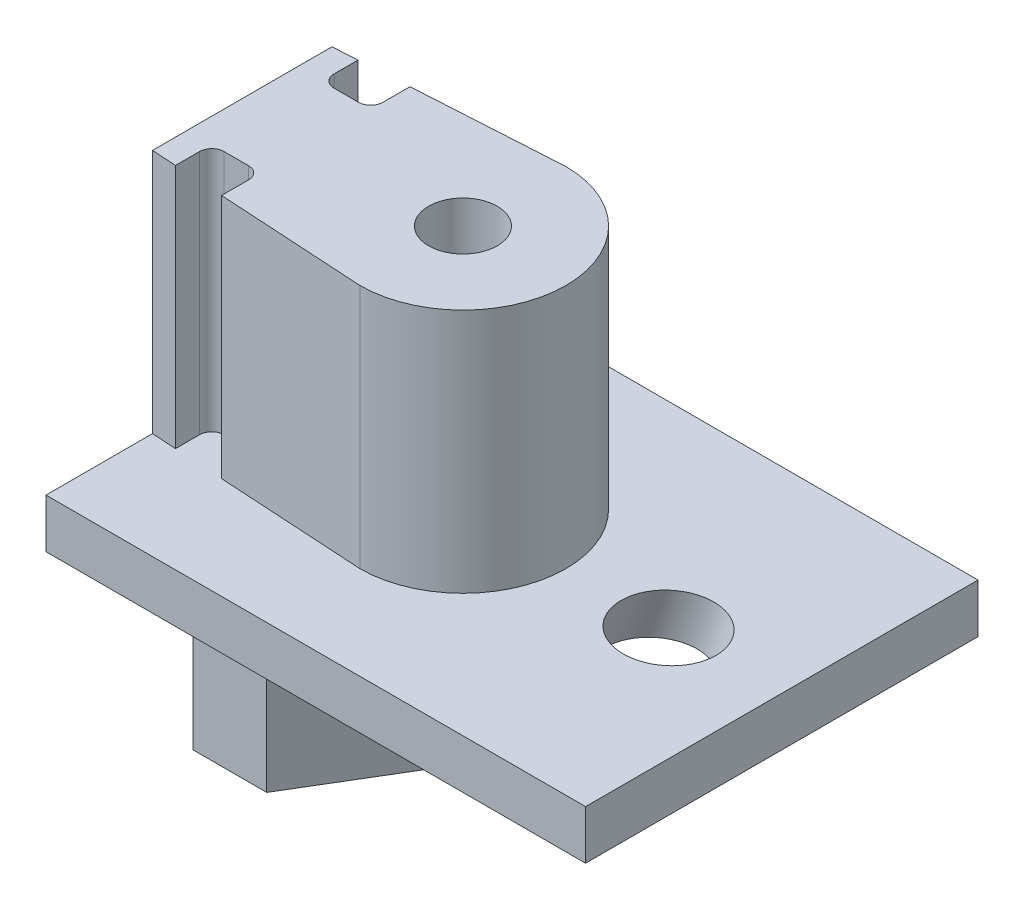
ISO-10303-21;
HEADER;
FILE_DESCRIPTION(('STEP AP214'),'2;1');
FILE_NAME('part.step','',(''),(''),'','','');
FILE_SCHEMA(('AUTOMOTIVE_DESIGN { 1 0 10303 214 1 1 1 1 }'));
ENDSEC;
DATA;
#1=APPLICATION_CONTEXT('core data for automotive mechanical design processes');
#2=APPLICATION_PROTOCOL_DEFINITION('international standard','automotive_design',2000,#1);
#3=PRODUCT_CONTEXT('',#1,'mechanical');
#4=PRODUCT('Part','Part','',(#3));
#5=PRODUCT_RELATED_PRODUCT_CATEGORY('part','',(#4));
#6=PRODUCT_DEFINITION_FORMATION('','',#4);
#7=PRODUCT_DEFINITION_CONTEXT('part definition',#1,'design');
#8=PRODUCT_DEFINITION('design','',#6,#7);
#9=PRODUCT_DEFINITION_SHAPE('','',#8);
#10=(LENGTH_UNIT() NAMED_UNIT(*) SI_UNIT(.MILLI.,.METRE.));
#11=(NAMED_UNIT(*) PLANE_ANGLE_UNIT() SI_UNIT($,.RADIAN.));
#12=(NAMED_UNIT(*) SI_UNIT($,.STERADIAN.) SOLID_ANGLE_UNIT());
#13=UNCERTAINTY_MEASURE_WITH_UNIT(LENGTH_MEASURE(1.E-05),#10,'distance_accuracy_value','');
#14=(GEOMETRIC_REPRESENTATION_CONTEXT(3) GLOBAL_UNCERTAINTY_ASSIGNED_CONTEXT((#13)) GLOBAL_UNIT_ASSIGNED_CONTEXT((#10,
#11,#12)) REPRESENTATION_CONTEXT('',''));
#15=CARTESIAN_POINT('',(0.,0.,0.));
#16=DIRECTION('',(0.,0.,1.));
#17=DIRECTION('',(1.,0.,0.));
#18=AXIS2_PLACEMENT_3D('',#15,#16,#17);
#19=CARTESIAN_POINT('',(-2.50000000000002,2.5,0.9));
#20=DIRECTION('',(0.0598922907279451,0.,-0.998204845465779));
#21=DIRECTION('',(-0.998204845465779,0.,-0.0598922907279451));
#22=AXIS2_PLACEMENT_3D('',#19,#20,#21);
#23=PLANE('',#22);
#24=DIRECTION('',(0.998204845465779,0.,0.0598922907279451));
#25=VECTOR('',#24,1.);
#26=CARTESIAN_POINT('',(-2.50000000000002,2.5,0.9));
#27=LINE('',#26,#25);
#28=CARTESIAN_POINT('',(-2.25,2.5,0.915000000000001));
#29=VERTEX_POINT('',#28);
#30=CARTESIAN_POINT('',(-2.,2.5,0.93));
#31=VERTEX_POINT('',#30);
#32=EDGE_CURVE('E295',#29,#31,#27,.T.);
#33=ORIENTED_EDGE('',*,*,#32,.F.);
#34=DIRECTION('',(0.,-1.,0.));
#35=VECTOR('',#34,1.);
#36=CARTESIAN_POINT('',(-2.25,2.5,0.915000000000001));
#37=LINE('',#36,#35);
#38=CARTESIAN_POINT('',(-2.25,0.,0.915000000000001));
#39=VERTEX_POINT('',#38);
#40=EDGE_CURVE('E236',#29,#39,#37,.T.);
#41=ORIENTED_EDGE('',*,*,#40,.T.);
#42=DIRECTION('',(0.998204845465779,0.,0.0598922907279451));
#43=VECTOR('',#42,1.);
#44=CARTESIAN_POINT('',(-2.50000000000002,0.,0.9));
#45=LINE('',#44,#43);
#46=CARTESIAN_POINT('',(-2.,0.,0.93));
#47=VERTEX_POINT('',#46);
#48=EDGE_CURVE('E292',#39,#47,#45,.T.);
#49=ORIENTED_EDGE('',*,*,#48,.T.);
#50=DIRECTION('',(0.,-1.,0.));
#51=VECTOR('',#50,1.);
#52=CARTESIAN_POINT('',(-2.,2.5,0.93));
#53=LINE('',#52,#51);
#54=EDGE_CURVE('E365',#31,#47,#53,.T.);
#55=ORIENTED_EDGE('',*,*,#54,.F.);
#56=EDGE_LOOP('',(#33,#41,#49,#55));
#57=FACE_BOUND('',#56,.T.);
#58=ADVANCED_FACE('F37',(#57),#23,.F.);
#59=CARTESIAN_POINT('',(-2.,2.5,0.93));
#60=DIRECTION('',(-1.,0.,0.));
#61=DIRECTION('',(0.,0.,1.));
#62=AXIS2_PLACEMENT_3D('',#59,#60,#61);
#63=PLANE('',#62);
#64=DIRECTION('',(0.,0.,-1.));
#65=VECTOR('',#64,1.);
#66=CARTESIAN_POINT('',(-2.,0.,0.93));
#67=LINE('',#66,#65);
#68=CARTESIAN_POINT('',(-2.,0.,0.685));
#69=VERTEX_POINT('',#68);
#70=EDGE_CURVE('E329',#47,#69,#67,.T.);
#71=ORIENTED_EDGE('',*,*,#70,.T.);
#72=DIRECTION('',(0.,-1.,0.));
#73=VECTOR('',#72,1.);
#74=CARTESIAN_POINT('',(-2.,2.5,0.685));
#75=LINE('',#74,#73);
#76=CARTESIAN_POINT('',(-2.,2.5,0.685));
#77=VERTEX_POINT('',#76);
#78=EDGE_CURVE('E373',#69,#77,#75,.F.);
#79=ORIENTED_EDGE('',*,*,#78,.T.);
#80=DIRECTION('',(0.,0.,-1.));
#81=VECTOR('',#80,1.);
#82=CARTESIAN_POINT('',(-2.,2.5,0.93));
#83=LINE('',#82,#81);
#84=EDGE_CURVE('E297',#31,#77,#83,.T.);
#85=ORIENTED_EDGE('',*,*,#84,.F.);
#86=ORIENTED_EDGE('',*,*,#54,.T.);
#87=EDGE_LOOP('',(#71,#79,#85,#86));
#88=FACE_BOUND('',#87,.T.);
#89=ADVANCED_FACE('F464',(#88),#63,.F.);
#90=CARTESIAN_POINT('',(-1.5,2.5,0.56));
#91=DIRECTION('',(0.,0.,1.));
#92=DIRECTION('',(1.,0.,0.));
#93=AXIS2_PLACEMENT_3D('',#90,#91,#92);
#94=PLANE('',#93);
#95=DIRECTION('',(-1.,0.,0.));
#96=VECTOR('',#95,1.);
#97=CARTESIAN_POINT('',(-1.5,2.5,0.56));
#98=LINE('',#97,#96);
#99=CARTESIAN_POINT('',(-1.625,2.5,0.56));
#100=VERTEX_POINT('',#99);
#101=CARTESIAN_POINT('',(-1.875,2.5,0.56));
#102=VERTEX_POINT('',#101);
#103=EDGE_CURVE('E301',#100,#102,#98,.T.);
#104=ORIENTED_EDGE('',*,*,#103,.T.);
#105=DIRECTION('',(0.,-1.,0.));
#106=VECTOR('',#105,1.);
#107=CARTESIAN_POINT('',(-1.875,2.5,0.56));
#108=LINE('',#107,#106);
#109=CARTESIAN_POINT('',(-1.875,0.,0.56));
#110=VERTEX_POINT('',#109);
#111=EDGE_CURVE('E370',#102,#110,#108,.T.);
#112=ORIENTED_EDGE('',*,*,#111,.T.);
#113=DIRECTION('',(-1.,0.,0.));
#114=VECTOR('',#113,1.);
#115=CARTESIAN_POINT('',(-1.5,0.,0.56));
#116=LINE('',#115,#114);
#117=CARTESIAN_POINT('',(-1.625,0.,0.56));
#118=VERTEX_POINT('',#117);
#119=EDGE_CURVE('E332',#118,#110,#116,.T.);
#120=ORIENTED_EDGE('',*,*,#119,.F.);
#121=DIRECTION('',(0.,-1.,0.));
#122=VECTOR('',#121,1.);
#123=CARTESIAN_POINT('',(-1.625,2.5,0.56));
#124=LINE('',#123,#122);
#125=EDGE_CURVE('E368',#118,#100,#124,.F.);
#126=ORIENTED_EDGE('',*,*,#125,.T.);
#127=EDGE_LOOP('',(#104,#112,#120,#126));
#128=FACE_BOUND('',#127,.T.);
#129=ADVANCED_FACE('F454',(#128),#94,.T.);
#130=CARTESIAN_POINT('',(-1.5,2.5,0.56));
#131=DIRECTION('',(1.,0.,0.));
#132=DIRECTION('',(0.,0.,-1.));
#133=AXIS2_PLACEMENT_3D('',#130,#131,#132);
#134=PLANE('',#133);
#135=DIRECTION('',(0.,0.,1.));
#136=VECTOR('',#135,1.);
#137=CARTESIAN_POINT('',(-1.5,2.5,0.56));
#138=LINE('',#137,#136);
#139=CARTESIAN_POINT('',(-1.5,2.5,0.685));
#140=VERTEX_POINT('',#139);
#141=CARTESIAN_POINT('',(-1.5,2.5,0.96));
#142=VERTEX_POINT('',#141);
#143=EDGE_CURVE('E304',#140,#142,#138,.T.);
#144=ORIENTED_EDGE('',*,*,#143,.F.);
#145=DIRECTION('',(0.,-1.,0.));
#146=VECTOR('',#145,1.);
#147=CARTESIAN_POINT('',(-1.5,2.5,0.685));
#148=LINE('',#147,#146);
#149=CARTESIAN_POINT('',(-1.5,0.,0.685));
#150=VERTEX_POINT('',#149);
#151=EDGE_CURVE('E375',#140,#150,#148,.T.);
#152=ORIENTED_EDGE('',*,*,#151,.T.);
#153=DIRECTION('',(0.,0.,1.));
#154=VECTOR('',#153,1.);
#155=CARTESIAN_POINT('',(-1.5,0.,0.56));
#156=LINE('',#155,#154);
#157=CARTESIAN_POINT('',(-1.5,0.,0.96));
#158=VERTEX_POINT('',#157);
#159=EDGE_CURVE('E334',#150,#158,#156,.T.);
#160=ORIENTED_EDGE('',*,*,#159,.T.);
#161=DIRECTION('',(0.,-1.,0.));
#162=VECTOR('',#161,1.);
#163=CARTESIAN_POINT('',(-1.5,2.5,0.96));
#164=LINE('',#163,#162);
#165=EDGE_CURVE('E362',#142,#158,#164,.T.);
#166=ORIENTED_EDGE('',*,*,#165,.F.);
#167=EDGE_LOOP('',(#144,#152,#160,#166));
#168=FACE_BOUND('',#167,.T.);
#169=ADVANCED_FACE('F444',(#168),#134,.F.);
#170=CARTESIAN_POINT('',(0.,2.5,1.05));
#171=DIRECTION('',(-0.0598922907279466,0.,0.998204845465779));
#172=DIRECTION('',(0.998204845465779,0.,0.0598922907279466));
#173=AXIS2_PLACEMENT_3D('',#170,#171,#172);
#174=PLANE('',#173);
#175=DIRECTION('',(-0.998204845465779,0.,-0.0598922907279466));
#176=VECTOR('',#175,1.);
#177=CARTESIAN_POINT('',(0.,0.,1.05));
#178=LINE('',#177,#176);
#179=CARTESIAN_POINT('',(0.,0.,1.05));
#180=VERTEX_POINT('',#179);
#181=EDGE_CURVE('E337',#180,#158,#178,.T.);
#182=ORIENTED_EDGE('',*,*,#181,.F.);
#183=DIRECTION('',(0.,-1.,0.));
#184=VECTOR('',#183,1.);
#185=CARTESIAN_POINT('',(0.,2.5,1.05));
#186=LINE('',#185,#184);
#187=CARTESIAN_POINT('',(0.,2.5,1.05));
#188=VERTEX_POINT('',#187);
#189=EDGE_CURVE('E359',#188,#180,#186,.T.);
#190=ORIENTED_EDGE('',*,*,#189,.F.);
#191=DIRECTION('',(-0.998204845465779,0.,-0.0598922907279466));
#192=VECTOR('',#191,1.);
#193=CARTESIAN_POINT('',(0.,2.5,1.05));
#194=LINE('',#193,#192);
#195=EDGE_CURVE('E306',#188,#142,#194,.T.);
#196=ORIENTED_EDGE('',*,*,#195,.T.);
#197=ORIENTED_EDGE('',*,*,#165,.T.);
#198=EDGE_LOOP('',(#182,#190,#196,#197));
#199=FACE_BOUND('',#198,.T.);
#200=ADVANCED_FACE('F440',(#199),#174,.T.);
#201=CARTESIAN_POINT('',(0.,2.5,0.));
#202=DIRECTION('',(0.,-1.,0.));
#203=DIRECTION('',(0.,0.,-1.));
#204=AXIS2_PLACEMENT_3D('',#201,#202,#203);
#205=CYLINDRICAL_SURFACE('',#204,1.05);
#206=CARTESIAN_POINT('',(0.,0.,0.));
#207=DIRECTION('',(0.,-1.,0.));
#208=DIRECTION('',(0.,0.,-1.));
#209=AXIS2_PLACEMENT_3D('',#206,#207,#208);
#210=CIRCLE('',#209,1.05);
#211=CARTESIAN_POINT('',(0.,0.,-1.05));
#212=VERTEX_POINT('',#211);
#213=EDGE_CURVE('E339',#212,#180,#210,.T.);
#214=ORIENTED_EDGE('',*,*,#213,.F.);
#215=DIRECTION('',(0.,-1.,0.));
#216=VECTOR('',#215,1.);
#217=CARTESIAN_POINT('',(0.,2.5,-1.05));
#218=LINE('',#217,#216);
#219=CARTESIAN_POINT('',(0.,2.5,-1.05));
#220=VERTEX_POINT('',#219);
#221=EDGE_CURVE('E356',#220,#212,#218,.T.);
#222=ORIENTED_EDGE('',*,*,#221,.F.);
#223=CARTESIAN_POINT('',(0.,2.5,0.));
#224=DIRECTION('',(0.,-1.,0.));
#225=DIRECTION('',(0.,0.,-1.));
#226=AXIS2_PLACEMENT_3D('',#223,#224,#225);
#227=CIRCLE('',#226,1.05);
#228=EDGE_CURVE('E309',#220,#188,#227,.T.);
#229=ORIENTED_EDGE('',*,*,#228,.T.);
#230=ORIENTED_EDGE('',*,*,#189,.T.);
#231=EDGE_LOOP('',(#214,#222,#229,#230));
#232=FACE_BOUND('',#231,.T.);
#233=ADVANCED_FACE('F436',(#232),#205,.T.);
#234=CARTESIAN_POINT('',(-1.5,2.5,-0.96));
#235=DIRECTION('',(-0.0598922907279466,0.,-0.998204845465779));
#236=DIRECTION('',(-0.998204845465779,0.,0.0598922907279466));
#237=AXIS2_PLACEMENT_3D('',#234,#235,#236);
#238=PLANE('',#237);
#239=DIRECTION('',(0.998204845465779,0.,-0.0598922907279466));
#240=VECTOR('',#239,1.);
#241=CARTESIAN_POINT('',(-1.5,0.,-0.96));
#242=LINE('',#241,#240);
#243=CARTESIAN_POINT('',(-1.5,0.,-0.96));
#244=VERTEX_POINT('',#243);
#245=EDGE_CURVE('E341',#244,#212,#242,.T.);
#246=ORIENTED_EDGE('',*,*,#245,.F.);
#247=DIRECTION('',(0.,-1.,0.));
#248=VECTOR('',#247,1.);
#249=CARTESIAN_POINT('',(-1.5,2.5,-0.96));
#250=LINE('',#249,#248);
#251=CARTESIAN_POINT('',(-1.5,2.5,-0.96));
#252=VERTEX_POINT('',#251);
#253=EDGE_CURVE('E353',#252,#244,#250,.T.);
#254=ORIENTED_EDGE('',*,*,#253,.F.);
#255=DIRECTION('',(0.998204845465779,0.,-0.0598922907279466));
#256=VECTOR('',#255,1.);
#257=CARTESIAN_POINT('',(-1.5,2.5,-0.96));
#258=LINE('',#257,#256);
#259=EDGE_CURVE('E312',#252,#220,#258,.T.);
#260=ORIENTED_EDGE('',*,*,#259,.T.);
#261=ORIENTED_EDGE('',*,*,#221,.T.);
#262=EDGE_LOOP('',(#246,#254,#260,#261));
#263=FACE_BOUND('',#262,.T.);
#264=ADVANCED_FACE('F432',(#263),#238,.T.);
#265=CARTESIAN_POINT('',(-1.5,2.5,-0.96));
#266=DIRECTION('',(1.,0.,0.));
#267=DIRECTION('',(0.,0.,-1.));
#268=AXIS2_PLACEMENT_3D('',#265,#266,#267);
#269=PLANE('',#268);
#270=DIRECTION('',(0.,0.,1.));
#271=VECTOR('',#270,1.);
#272=CARTESIAN_POINT('',(-1.5,0.,-0.96));
#273=LINE('',#272,#271);
#274=CARTESIAN_POINT('',(-1.5,0.,-0.685));
#275=VERTEX_POINT('',#274);
#276=EDGE_CURVE('E343',#244,#275,#273,.T.);
#277=ORIENTED_EDGE('',*,*,#276,.T.);
#278=DIRECTION('',(0.,-1.,0.));
#279=VECTOR('',#278,1.);
#280=CARTESIAN_POINT('',(-1.5,2.5,-0.685));
#281=LINE('',#280,#279);
#282=CARTESIAN_POINT('',(-1.5,2.5,-0.685));
#283=VERTEX_POINT('',#282);
#284=EDGE_CURVE('E383',#275,#283,#281,.F.);
#285=ORIENTED_EDGE('',*,*,#284,.T.);
#286=DIRECTION('',(0.,0.,1.));
#287=VECTOR('',#286,1.);
#288=CARTESIAN_POINT('',(-1.5,2.5,-0.96));
#289=LINE('',#288,#287);
#290=EDGE_CURVE('E315',#252,#283,#289,.T.);
#291=ORIENTED_EDGE('',*,*,#290,.F.);
#292=ORIENTED_EDGE('',*,*,#253,.T.);
#293=EDGE_LOOP('',(#277,#285,#291,#292));
#294=FACE_BOUND('',#293,.T.);
#295=ADVANCED_FACE('F427',(#294),#269,.F.);
#296=CARTESIAN_POINT('',(-2.,2.5,-0.56));
#297=DIRECTION('',(0.,0.,-1.));
#298=DIRECTION('',(-1.,0.,0.));
#299=AXIS2_PLACEMENT_3D('',#296,#297,#298);
#300=PLANE('',#299);
#301=DIRECTION('',(1.,0.,0.));
#302=VECTOR('',#301,1.);
#303=CARTESIAN_POINT('',(-2.,2.5,-0.56));
#304=LINE('',#303,#302);
#305=CARTESIAN_POINT('',(-1.875,2.5,-0.56));
#306=VERTEX_POINT('',#305);
#307=CARTESIAN_POINT('',(-1.625,2.5,-0.56));
#308=VERTEX_POINT('',#307);
#309=EDGE_CURVE('E318',#306,#308,#304,.T.);
#310=ORIENTED_EDGE('',*,*,#309,.T.);
#311=DIRECTION('',(0.,-1.,0.));
#312=VECTOR('',#311,1.);
#313=CARTESIAN_POINT('',(-1.625,2.5,-0.56));
#314=LINE('',#313,#312);
#315=CARTESIAN_POINT('',(-1.625,0.,-0.56));
#316=VERTEX_POINT('',#315);
#317=EDGE_CURVE('E380',#308,#316,#314,.T.);
#318=ORIENTED_EDGE('',*,*,#317,.T.);
#319=DIRECTION('',(1.,0.,0.));
#320=VECTOR('',#319,1.);
#321=CARTESIAN_POINT('',(-2.,0.,-0.56));
#322=LINE('',#321,#320);
#323=CARTESIAN_POINT('',(-1.875,0.,-0.56));
#324=VERTEX_POINT('',#323);
#325=EDGE_CURVE('E346',#324,#316,#322,.T.);
#326=ORIENTED_EDGE('',*,*,#325,.F.);
#327=DIRECTION('',(0.,-1.,0.));
#328=VECTOR('',#327,1.);
#329=CARTESIAN_POINT('',(-1.875,2.5,-0.56));
#330=LINE('',#329,#328);
#331=EDGE_CURVE('E378',#324,#306,#330,.F.);
#332=ORIENTED_EDGE('',*,*,#331,.T.);
#333=EDGE_LOOP('',(#310,#318,#326,#332));
#334=FACE_BOUND('',#333,.T.);
#335=ADVANCED_FACE('F420',(#334),#300,.T.);
#336=CARTESIAN_POINT('',(-2.,2.5,-0.93));
#337=DIRECTION('',(1.,0.,0.));
#338=DIRECTION('',(0.,0.,-1.));
#339=AXIS2_PLACEMENT_3D('',#336,#337,#338);
#340=PLANE('',#339);
#341=DIRECTION('',(0.,0.,1.));
#342=VECTOR('',#341,1.);
#343=CARTESIAN_POINT('',(-2.,2.5,-0.93));
#344=LINE('',#343,#342);
#345=CARTESIAN_POINT('',(-2.,2.5,-0.93));
#346=VERTEX_POINT('',#345);
#347=CARTESIAN_POINT('',(-2.,2.5,-0.685));
#348=VERTEX_POINT('',#347);
#349=EDGE_CURVE('E321',#346,#348,#344,.T.);
#350=ORIENTED_EDGE('',*,*,#349,.T.);
#351=DIRECTION('',(0.,-1.,0.));
#352=VECTOR('',#351,1.);
#353=CARTESIAN_POINT('',(-2.,0.,-0.685));
#354=LINE('',#353,#352);
#355=CARTESIAN_POINT('',(-2.,0.,-0.685));
#356=VERTEX_POINT('',#355);
#357=EDGE_CURVE('E385',#348,#356,#354,.T.);
#358=ORIENTED_EDGE('',*,*,#357,.T.);
#359=DIRECTION('',(0.,0.,1.));
#360=VECTOR('',#359,1.);
#361=CARTESIAN_POINT('',(-2.,0.,-0.93));
#362=LINE('',#361,#360);
#363=CARTESIAN_POINT('',(-2.,0.,-0.93));
#364=VERTEX_POINT('',#363);
#365=EDGE_CURVE('E348',#364,#356,#362,.T.);
#366=ORIENTED_EDGE('',*,*,#365,.F.);
#367=DIRECTION('',(0.,-1.,0.));
#368=VECTOR('',#367,1.);
#369=CARTESIAN_POINT('',(-2.,2.5,-0.93));
#370=LINE('',#369,#368);
#371=EDGE_CURVE('E326',#346,#364,#370,.T.);
#372=ORIENTED_EDGE('',*,*,#371,.F.);
#373=EDGE_LOOP('',(#350,#358,#366,#372));
#374=FACE_BOUND('',#373,.T.);
#375=ADVANCED_FACE('F412',(#374),#340,.T.);
#376=CARTESIAN_POINT('',(-2.50000000000002,2.5,-0.9));
#377=DIRECTION('',(-0.0598922907279451,0.,-0.998204845465779));
#378=DIRECTION('',(-0.998204845465779,0.,0.0598922907279451));
#379=AXIS2_PLACEMENT_3D('',#376,#377,#378);
#380=PLANE('',#379);
#381=DIRECTION('',(0.,-1.,0.));
#382=VECTOR('',#381,1.);
#383=CARTESIAN_POINT('',(-2.25,2.5,-0.915000000000001));
#384=LINE('',#383,#382);
#385=CARTESIAN_POINT('',(-2.25,2.5,-0.915));
#386=VERTEX_POINT('',#385);
#387=CARTESIAN_POINT('',(-2.25,0.,-0.915));
#388=VERTEX_POINT('',#387);
#389=EDGE_CURVE('E243',#386,#388,#384,.T.);
#390=ORIENTED_EDGE('',*,*,#389,.F.);
#391=DIRECTION('',(0.998204845465779,0.,-0.0598922907279451));
#392=VECTOR('',#391,1.);
#393=CARTESIAN_POINT('',(-2.50000000000002,2.5,-0.9));
#394=LINE('',#393,#392);
#395=EDGE_CURVE('E324',#386,#346,#394,.T.);
#396=ORIENTED_EDGE('',*,*,#395,.T.);
#397=ORIENTED_EDGE('',*,*,#371,.T.);
#398=DIRECTION('',(0.998204845465779,0.,-0.0598922907279451));
#399=VECTOR('',#398,1.);
#400=CARTESIAN_POINT('',(-2.50000000000002,0.,-0.9));
#401=LINE('',#400,#399);
#402=EDGE_CURVE('E298',#388,#364,#401,.T.);
#403=ORIENTED_EDGE('',*,*,#402,.F.);
#404=EDGE_LOOP('',(#390,#396,#397,#403));
#405=FACE_BOUND('',#404,.T.);
#406=ADVANCED_FACE('F491',(#405),#380,.T.);
#407=CARTESIAN_POINT('',(0.,2.5,0.));
#408=DIRECTION('',(0.,-1.,0.));
#409=DIRECTION('',(0.,0.,-1.));
#410=AXIS2_PLACEMENT_3D('',#407,#408,#409);
#411=PLANE('',#410);
#412=CARTESIAN_POINT('',(0.,2.5,0.));
#413=DIRECTION('',(0.,1.,0.));
#414=DIRECTION('',(0.,0.,1.));
#415=AXIS2_PLACEMENT_3D('',#412,#413,#414);
#416=CIRCLE('',#415,0.35);
#417=CARTESIAN_POINT('',(0.,2.5,0.35));
#418=VERTEX_POINT('',#417);
#419=EDGE_CURVE('E282',#418,#418,#416,.T.);
#420=ORIENTED_EDGE('',*,*,#419,.F.);
#421=EDGE_LOOP('',(#420));
#422=FACE_BOUND('',#421,.T.);
#423=ORIENTED_EDGE('',*,*,#395,.F.);
#424=DIRECTION('',(0.,0.,1.));
#425=VECTOR('',#424,1.);
#426=CARTESIAN_POINT('',(-2.25,2.5,2.));
#427=LINE('',#426,#425);
#428=EDGE_CURVE('E233',#386,#29,#427,.T.);
#429=ORIENTED_EDGE('',*,*,#428,.T.);
#430=ORIENTED_EDGE('',*,*,#32,.T.);
#431=ORIENTED_EDGE('',*,*,#84,.T.);
#432=CARTESIAN_POINT('',(-1.875,2.5,0.685));
#433=DIRECTION('',(0.,-1.,0.));
#434=DIRECTION('',(0.,0.,-1.));
#435=AXIS2_PLACEMENT_3D('',#432,#433,#434);
#436=CIRCLE('',#435,0.125);
#437=EDGE_CURVE('E390',#77,#102,#436,.T.);
#438=ORIENTED_EDGE('',*,*,#437,.T.);
#439=ORIENTED_EDGE('',*,*,#103,.F.);
#440=CARTESIAN_POINT('',(-1.625,2.5,0.685));
#441=DIRECTION('',(0.,-1.,0.));
#442=DIRECTION('',(0.,0.,-1.));
#443=AXIS2_PLACEMENT_3D('',#440,#441,#442);
#444=CIRCLE('',#443,0.125);
#445=EDGE_CURVE('E394',#100,#140,#444,.T.);
#446=ORIENTED_EDGE('',*,*,#445,.T.);
#447=ORIENTED_EDGE('',*,*,#143,.T.);
#448=ORIENTED_EDGE('',*,*,#195,.F.);
#449=ORIENTED_EDGE('',*,*,#228,.F.);
#450=ORIENTED_EDGE('',*,*,#259,.F.);
#451=ORIENTED_EDGE('',*,*,#290,.T.);
#452=CARTESIAN_POINT('',(-1.625,2.5,-0.685));
#453=DIRECTION('',(0.,-1.,0.));
#454=DIRECTION('',(0.,0.,-1.));
#455=AXIS2_PLACEMENT_3D('',#452,#453,#454);
#456=CIRCLE('',#455,0.125);
#457=EDGE_CURVE('E398',#283,#308,#456,.T.);
#458=ORIENTED_EDGE('',*,*,#457,.T.);
#459=ORIENTED_EDGE('',*,*,#309,.F.);
#460=CARTESIAN_POINT('',(-1.875,2.5,-0.685));
#461=DIRECTION('',(0.,-1.,0.));
#462=DIRECTION('',(0.,0.,-1.));
#463=AXIS2_PLACEMENT_3D('',#460,#461,#462);
#464=CIRCLE('',#463,0.125);
#465=EDGE_CURVE('E46',#306,#348,#464,.T.);
#466=ORIENTED_EDGE('',*,*,#465,.T.);
#467=ORIENTED_EDGE('',*,*,#349,.F.);
#468=EDGE_LOOP('',(#423,#429,#430,#431,#438,#439,#446,#447,#448,#449,#450,#451,#458,#459,#466,#467));
#469=FACE_BOUND('',#468,.T.);
#470=ADVANCED_FACE('F406',(#422,#469),#411,.F.);
#471=CARTESIAN_POINT('',(0.,0.,0.));
#472=DIRECTION('',(0.,1.,0.));
#473=DIRECTION('',(0.,0.,1.));
#474=AXIS2_PLACEMENT_3D('',#471,#472,#473);
#475=CYLINDRICAL_SURFACE('',#474,0.35);
#476=CARTESIAN_POINT('',(0.,0.,0.));
#477=DIRECTION('',(0.,1.,0.));
#478=DIRECTION('',(0.,0.,1.));
#479=AXIS2_PLACEMENT_3D('',#476,#477,#478);
#480=CIRCLE('',#479,0.35);
#481=CARTESIAN_POINT('',(0.,0.,0.35));
#482=VERTEX_POINT('',#481);
#483=EDGE_CURVE('E289',#482,#482,#480,.T.);
#484=ORIENTED_EDGE('',*,*,#483,.F.);
#485=EDGE_LOOP('',(#484));
#486=FACE_BOUND('',#485,.T.);
#487=ORIENTED_EDGE('',*,*,#419,.T.);
#488=EDGE_LOOP('',(#487));
#489=FACE_BOUND('',#488,.T.);
#490=ADVANCED_FACE('F498',(#486,#489),#475,.F.);
#491=CARTESIAN_POINT('',(-1.875,2.5,0.685));
#492=DIRECTION('',(0.,-1.,0.));
#493=DIRECTION('',(0.,0.,-1.));
#494=AXIS2_PLACEMENT_3D('',#491,#492,#493);
#495=CYLINDRICAL_SURFACE('',#494,0.125);
#496=ORIENTED_EDGE('',*,*,#437,.F.);
#497=ORIENTED_EDGE('',*,*,#78,.F.);
#498=CARTESIAN_POINT('',(-1.875,0.,0.685));
#499=DIRECTION('',(0.,-1.,0.));
#500=DIRECTION('',(0.,0.,-1.));
#501=AXIS2_PLACEMENT_3D('',#498,#499,#500);
#502=CIRCLE('',#501,0.125);
#503=EDGE_CURVE('E388',#110,#69,#502,.F.);
#504=ORIENTED_EDGE('',*,*,#503,.F.);
#505=ORIENTED_EDGE('',*,*,#111,.F.);
#506=EDGE_LOOP('',(#496,#497,#504,#505));
#507=FACE_BOUND('',#506,.T.);
#508=ADVANCED_FACE('F460',(#507),#495,.F.);
#509=CARTESIAN_POINT('',(-1.625,2.5,0.685));
#510=DIRECTION('',(0.,-1.,0.));
#511=DIRECTION('',(0.,0.,-1.));
#512=AXIS2_PLACEMENT_3D('',#509,#510,#511);
#513=CYLINDRICAL_SURFACE('',#512,0.125);
#514=ORIENTED_EDGE('',*,*,#445,.F.);
#515=ORIENTED_EDGE('',*,*,#125,.F.);
#516=CARTESIAN_POINT('',(-1.625,0.,0.685));
#517=DIRECTION('',(0.,-1.,0.));
#518=DIRECTION('',(0.,0.,-1.));
#519=AXIS2_PLACEMENT_3D('',#516,#517,#518);
#520=CIRCLE('',#519,0.125);
#521=EDGE_CURVE('E392',#150,#118,#520,.F.);
#522=ORIENTED_EDGE('',*,*,#521,.F.);
#523=ORIENTED_EDGE('',*,*,#151,.F.);
#524=EDGE_LOOP('',(#514,#515,#522,#523));
#525=FACE_BOUND('',#524,.T.);
#526=ADVANCED_FACE('F451',(#525),#513,.F.);
#527=CARTESIAN_POINT('',(-1.625,2.5,-0.685));
#528=DIRECTION('',(0.,-1.,0.));
#529=DIRECTION('',(0.,0.,-1.));
#530=AXIS2_PLACEMENT_3D('',#527,#528,#529);
#531=CYLINDRICAL_SURFACE('',#530,0.125);
#532=ORIENTED_EDGE('',*,*,#457,.F.);
#533=ORIENTED_EDGE('',*,*,#284,.F.);
#534=CARTESIAN_POINT('',(-1.625,0.,-0.685));
#535=DIRECTION('',(0.,-1.,0.));
#536=DIRECTION('',(0.,0.,-1.));
#537=AXIS2_PLACEMENT_3D('',#534,#535,#536);
#538=CIRCLE('',#537,0.125);
#539=EDGE_CURVE('E396',#316,#275,#538,.F.);
#540=ORIENTED_EDGE('',*,*,#539,.F.);
#541=ORIENTED_EDGE('',*,*,#317,.F.);
#542=EDGE_LOOP('',(#532,#533,#540,#541));
#543=FACE_BOUND('',#542,.T.);
#544=ADVANCED_FACE('F424',(#543),#531,.F.);
#545=CARTESIAN_POINT('',(-1.875,2.5,-0.685));
#546=DIRECTION('',(0.,1.,0.));
#547=DIRECTION('',(0.,0.,1.));
#548=AXIS2_PLACEMENT_3D('',#545,#546,#547);
#549=CYLINDRICAL_SURFACE('',#548,0.125);
#550=ORIENTED_EDGE('',*,*,#465,.F.);
#551=ORIENTED_EDGE('',*,*,#331,.F.);
#552=CARTESIAN_POINT('',(-1.875,0.,-0.685));
#553=DIRECTION('',(0.,-1.,0.));
#554=DIRECTION('',(0.,0.,-1.));
#555=AXIS2_PLACEMENT_3D('',#552,#553,#554);
#556=CIRCLE('',#555,0.125);
#557=EDGE_CURVE('E400',#356,#324,#556,.F.);
#558=ORIENTED_EDGE('',*,*,#557,.F.);
#559=ORIENTED_EDGE('',*,*,#357,.F.);
#560=EDGE_LOOP('',(#550,#551,#558,#559));
#561=FACE_BOUND('',#560,.T.);
#562=ADVANCED_FACE('F39',(#561),#549,.F.);
#563=CARTESIAN_POINT('',(0.,0.,0.));
#564=DIRECTION('',(0.,-1.,0.));
#565=DIRECTION('',(0.,0.,-1.));
#566=AXIS2_PLACEMENT_3D('',#563,#564,#565);
#567=PLANE('',#566);
#568=CARTESIAN_POINT('',(0.,0.,0.));
#569=DIRECTION('',(0.,1.,0.));
#570=DIRECTION('',(0.,0.,1.));
#571=AXIS2_PLACEMENT_3D('',#568,#569,#570);
#572=CIRCLE('',#571,0.125);
#573=CARTESIAN_POINT('',(0.,0.,0.125));
#574=VERTEX_POINT('',#573);
#575=EDGE_CURVE('E248',#574,#574,#572,.T.);
#576=ORIENTED_EDGE('',*,*,#575,.F.);
#577=EDGE_LOOP('',(#576));
#578=FACE_BOUND('',#577,.T.);
#579=ORIENTED_EDGE('',*,*,#483,.T.);
#580=EDGE_LOOP('',(#579));
#581=FACE_BOUND('',#580,.T.);
#582=ADVANCED_FACE('F517',(#578,#581),#567,.F.);
#583=CARTESIAN_POINT('',(2.09546854596071,0.,0.));
#584=DIRECTION('',(0.,-1.,0.));
#585=DIRECTION('',(1.,0.,0.));
#586=AXIS2_PLACEMENT_3D('',#583,#584,#585);
#587=ELLIPSE('',#586,0.484882574559151,0.46);
#588=CARTESIAN_POINT('',(2.58035112051986,0.,0.));
#589=VERTEX_POINT('',#588);
#590=EDGE_CURVE('E245',#589,#589,#587,.T.);
#591=ORIENTED_EDGE('',*,*,#590,.T.);
#592=EDGE_LOOP('',(#591));
#593=FACE_BOUND('',#592,.T.);
#594=DIRECTION('',(0.,0.,1.));
#595=VECTOR('',#594,1.);
#596=CARTESIAN_POINT('',(-2.25,0.,2.));
#597=LINE('',#596,#595);
#598=CARTESIAN_POINT('',(-2.25,0.,-2.));
#599=VERTEX_POINT('',#598);
#600=EDGE_CURVE('E271',#599,#388,#597,.T.);
#601=ORIENTED_EDGE('',*,*,#600,.T.);
#602=ORIENTED_EDGE('',*,*,#402,.T.);
#603=ORIENTED_EDGE('',*,*,#365,.T.);
#604=ORIENTED_EDGE('',*,*,#557,.T.);
#605=ORIENTED_EDGE('',*,*,#325,.T.);
#606=ORIENTED_EDGE('',*,*,#539,.T.);
#607=ORIENTED_EDGE('',*,*,#276,.F.);
#608=ORIENTED_EDGE('',*,*,#245,.T.);
#609=ORIENTED_EDGE('',*,*,#213,.T.);
#610=ORIENTED_EDGE('',*,*,#181,.T.);
#611=ORIENTED_EDGE('',*,*,#159,.F.);
#612=ORIENTED_EDGE('',*,*,#521,.T.);
#613=ORIENTED_EDGE('',*,*,#119,.T.);
#614=ORIENTED_EDGE('',*,*,#503,.T.);
#615=ORIENTED_EDGE('',*,*,#70,.F.);
#616=ORIENTED_EDGE('',*,*,#48,.F.);
#617=CARTESIAN_POINT('',(-2.25,0.,2.));
#618=VERTEX_POINT('',#617);
#619=EDGE_CURVE('E270',#39,#618,#597,.T.);
#620=ORIENTED_EDGE('',*,*,#619,.T.);
#621=DIRECTION('',(1.,0.,0.));
#622=VECTOR('',#621,1.);
#623=CARTESIAN_POINT('',(3.25,0.,2.));
#624=LINE('',#623,#622);
#625=CARTESIAN_POINT('',(3.25,0.,2.));
#626=VERTEX_POINT('',#625);
#627=EDGE_CURVE('E274',#618,#626,#624,.T.);
#628=ORIENTED_EDGE('',*,*,#627,.T.);
#629=DIRECTION('',(0.,0.,-1.));
#630=VECTOR('',#629,1.);
#631=CARTESIAN_POINT('',(3.25,0.,-2.));
#632=LINE('',#631,#630);
#633=CARTESIAN_POINT('',(3.25,0.,-2.));
#634=VERTEX_POINT('',#633);
#635=EDGE_CURVE('E259',#626,#634,#632,.T.);
#636=ORIENTED_EDGE('',*,*,#635,.T.);
#637=DIRECTION('',(-1.,0.,0.));
#638=VECTOR('',#637,1.);
#639=CARTESIAN_POINT('',(-2.25,0.,-2.));
#640=LINE('',#639,#638);
#641=EDGE_CURVE('E252',#634,#599,#640,.T.);
#642=ORIENTED_EDGE('',*,*,#641,.T.);
#643=EDGE_LOOP('',(#601,#602,#603,#604,#605,#606,#607,#608,#609,#610,#611,#612,#613,#614,#615,
#616,#620,#628,#636,#642));
#644=FACE_BOUND('',#643,.T.);
#645=ADVANCED_FACE('F417',(#593,#644),#567,.F.);
#646=CARTESIAN_POINT('',(3.25,-0.5,-2.));
#647=DIRECTION('',(1.,0.,0.));
#648=DIRECTION('',(0.,0.,-1.));
#649=AXIS2_PLACEMENT_3D('',#646,#647,#648);
#650=PLANE('',#649);
#651=ORIENTED_EDGE('',*,*,#635,.F.);
#652=DIRECTION('',(0.,1.,0.));
#653=VECTOR('',#652,1.);
#654=CARTESIAN_POINT('',(3.25,-0.5,2.));
#655=LINE('',#654,#653);
#656=CARTESIAN_POINT('',(3.25,-0.5,2.));
#657=VERTEX_POINT('',#656);
#658=EDGE_CURVE('E283',#657,#626,#655,.T.);
#659=ORIENTED_EDGE('',*,*,#658,.F.);
#660=DIRECTION('',(0.,0.,-1.));
#661=VECTOR('',#660,1.);
#662=CARTESIAN_POINT('',(3.25,-0.5,-2.));
#663=LINE('',#662,#661);
#664=CARTESIAN_POINT('',(3.25,-0.5,-2.));
#665=VERTEX_POINT('',#664);
#666=EDGE_CURVE('E264',#657,#665,#663,.T.);
#667=ORIENTED_EDGE('',*,*,#666,.T.);
#668=DIRECTION('',(0.,1.,0.));
#669=VECTOR('',#668,1.);
#670=CARTESIAN_POINT('',(3.25,-0.5,-2.));
#671=LINE('',#670,#669);
#672=EDGE_CURVE('E279',#665,#634,#671,.T.);
#673=ORIENTED_EDGE('',*,*,#672,.T.);
#674=EDGE_LOOP('',(#651,#659,#667,#673));
#675=FACE_BOUND('',#674,.T.);
#676=ADVANCED_FACE('F485',(#675),#650,.T.);
#677=CARTESIAN_POINT('',(3.25,-0.5,2.));
#678=DIRECTION('',(0.,0.,1.));
#679=DIRECTION('',(1.,0.,0.));
#680=AXIS2_PLACEMENT_3D('',#677,#678,#679);
#681=PLANE('',#680);
#682=ORIENTED_EDGE('',*,*,#627,.F.);
#683=DIRECTION('',(0.,1.,0.));
#684=VECTOR('',#683,1.);
#685=CARTESIAN_POINT('',(-2.25,-0.5,2.));
#686=LINE('',#685,#684);
#687=CARTESIAN_POINT('',(-2.25,-0.5,2.));
#688=VERTEX_POINT('',#687);
#689=EDGE_CURVE('E285',#688,#618,#686,.T.);
#690=ORIENTED_EDGE('',*,*,#689,.F.);
#691=DIRECTION('',(1.,0.,0.));
#692=VECTOR('',#691,1.);
#693=CARTESIAN_POINT('',(-2.25,-0.5,2.));
#694=LINE('',#693,#692);
#695=EDGE_CURVE('E262',#688,#657,#694,.T.);
#696=ORIENTED_EDGE('',*,*,#695,.T.);
#697=ORIENTED_EDGE('',*,*,#658,.T.);
#698=EDGE_LOOP('',(#682,#690,#696,#697));
#699=FACE_BOUND('',#698,.T.);
#700=ADVANCED_FACE('F473',(#699),#681,.T.);
#701=CARTESIAN_POINT('',(-2.25,-0.5,2.));
#702=DIRECTION('',(-1.,0.,0.));
#703=DIRECTION('',(0.,0.,1.));
#704=AXIS2_PLACEMENT_3D('',#701,#702,#703);
#705=PLANE('',#704);
#706=ORIENTED_EDGE('',*,*,#600,.F.);
#707=DIRECTION('',(0.,1.,0.));
#708=VECTOR('',#707,1.);
#709=CARTESIAN_POINT('',(-2.25,-0.5,-2.));
#710=LINE('',#709,#708);
#711=CARTESIAN_POINT('',(-2.25,-0.5,-2.));
#712=VERTEX_POINT('',#711);
#713=EDGE_CURVE('E267',#712,#599,#710,.T.);
#714=ORIENTED_EDGE('',*,*,#713,.F.);
#715=DIRECTION('',(0.,0.,1.));
#716=VECTOR('',#715,1.);
#717=CARTESIAN_POINT('',(-2.25,-0.5,2.));
#718=LINE('',#717,#716);
#719=EDGE_CURVE('E258',#712,#688,#718,.T.);
#720=ORIENTED_EDGE('',*,*,#719,.T.);
#721=ORIENTED_EDGE('',*,*,#689,.T.);
#722=ORIENTED_EDGE('',*,*,#619,.F.);
#723=ORIENTED_EDGE('',*,*,#40,.F.);
#724=ORIENTED_EDGE('',*,*,#428,.F.);
#725=ORIENTED_EDGE('',*,*,#389,.T.);
#726=EDGE_LOOP('',(#706,#714,#720,#721,#722,#723,#724,#725));
#727=FACE_BOUND('',#726,.T.);
#728=ADVANCED_FACE('F477',(#727),#705,.T.);
#729=CARTESIAN_POINT('',(-2.25,-0.5,-2.));
#730=DIRECTION('',(0.,0.,-1.));
#731=DIRECTION('',(-1.,0.,0.));
#732=AXIS2_PLACEMENT_3D('',#729,#730,#731);
#733=PLANE('',#732);
#734=ORIENTED_EDGE('',*,*,#641,.F.);
#735=ORIENTED_EDGE('',*,*,#672,.F.);
#736=DIRECTION('',(-1.,0.,0.));
#737=VECTOR('',#736,1.);
#738=CARTESIAN_POINT('',(1.75,-0.5,-2.));
#739=LINE('',#738,#737);
#740=EDGE_CURVE('E256',#665,#712,#739,.T.);
#741=ORIENTED_EDGE('',*,*,#740,.T.);
#742=ORIENTED_EDGE('',*,*,#713,.T.);
#743=EDGE_LOOP('',(#734,#735,#741,#742));
#744=FACE_BOUND('',#743,.T.);
#745=ADVANCED_FACE('F488',(#744),#733,.T.);
#746=CARTESIAN_POINT('',(0.,-0.5,0.));
#747=DIRECTION('',(0.,-1.,0.));
#748=DIRECTION('',(0.,0.,-1.));
#749=AXIS2_PLACEMENT_3D('',#746,#747,#748);
#750=PLANE('',#749);
#751=DIRECTION('',(-0.514495755427527,0.,0.857492925712544));
#752=VECTOR('',#751,1.);
#753=CARTESIAN_POINT('',(0.,-0.5,0.));
#754=LINE('',#753,#752);
#755=CARTESIAN_POINT('',(-0.0643119694284407,-0.5,0.107186615714068));
#756=VERTEX_POINT('',#755);
#757=CARTESIAN_POINT('',(-0.75,-0.5,1.25));
#758=VERTEX_POINT('',#757);
#759=EDGE_CURVE('E11',#756,#758,#754,.T.);
#760=ORIENTED_EDGE('',*,*,#759,.F.);
#761=CARTESIAN_POINT('',(0.,-0.5,0.));
#762=DIRECTION('',(0.,1.,0.));
#763=DIRECTION('',(0.,0.,1.));
#764=AXIS2_PLACEMENT_3D('',#761,#762,#763);
#765=CIRCLE('',#764,0.125);
#766=CARTESIAN_POINT('',(-0.0643119694284406,-0.5,-0.107186615714068));
#767=VERTEX_POINT('',#766);
#768=EDGE_CURVE('E253',#756,#767,#765,.T.);
#769=ORIENTED_EDGE('',*,*,#768,.T.);
#770=DIRECTION('',(0.514495755427526,0.,0.857492925712544));
#771=VECTOR('',#770,1.);
#772=CARTESIAN_POINT('',(-0.75,-0.5,-1.25));
#773=LINE('',#772,#771);
#774=CARTESIAN_POINT('',(-0.75,-0.5,-1.25));
#775=VERTEX_POINT('',#774);
#776=EDGE_CURVE('E61',#775,#767,#773,.T.);
#777=ORIENTED_EDGE('',*,*,#776,.F.);
#778=DIRECTION('',(1.,0.,0.));
#779=VECTOR('',#778,1.);
#780=CARTESIAN_POINT('',(-1.5,-0.5,-1.25));
#781=LINE('',#780,#779);
#782=CARTESIAN_POINT('',(-1.5,-0.5,-1.25));
#783=VERTEX_POINT('',#782);
#784=EDGE_CURVE('E728',#783,#775,#781,.T.);
#785=ORIENTED_EDGE('',*,*,#784,.F.);
#786=DIRECTION('',(0.,0.,-1.));
#787=VECTOR('',#786,1.);
#788=CARTESIAN_POINT('',(-1.5,-0.5,1.25));
#789=LINE('',#788,#787);
#790=CARTESIAN_POINT('',(-1.5,-0.5,1.25));
#791=VERTEX_POINT('',#790);
#792=EDGE_CURVE('E729',#791,#783,#789,.T.);
#793=ORIENTED_EDGE('',*,*,#792,.F.);
#794=DIRECTION('',(-1.,0.,0.));
#795=VECTOR('',#794,1.);
#796=CARTESIAN_POINT('',(-0.75,-0.5,1.25));
#797=LINE('',#796,#795);
#798=EDGE_CURVE('E55',#758,#791,#797,.T.);
#799=ORIENTED_EDGE('',*,*,#798,.F.);
#800=EDGE_LOOP('',(#760,#769,#777,#785,#793,#799));
#801=FACE_BOUND('',#800,.T.);
#802=CARTESIAN_POINT('',(1.92880187929405,-0.5,0.));
#803=DIRECTION('',(0.,-1.,0.));
#804=DIRECTION('',(1.,0.,0.));
#805=AXIS2_PLACEMENT_3D('',#802,#803,#804);
#806=ELLIPSE('',#805,0.484882574559151,0.46);
#807=CARTESIAN_POINT('',(2.4136844538532,-0.5,0.));
#808=VERTEX_POINT('',#807);
#809=EDGE_CURVE('E41',#808,#808,#806,.T.);
#810=ORIENTED_EDGE('',*,*,#809,.F.);
#811=EDGE_LOOP('',(#810));
#812=FACE_BOUND('',#811,.T.);
#813=ORIENTED_EDGE('',*,*,#740,.F.);
#814=ORIENTED_EDGE('',*,*,#666,.F.);
#815=ORIENTED_EDGE('',*,*,#695,.F.);
#816=ORIENTED_EDGE('',*,*,#719,.F.);
#817=EDGE_LOOP('',(#813,#814,#815,#816));
#818=FACE_BOUND('',#817,.T.);
#819=ADVANCED_FACE('F482',(#801,#812,#818),#750,.T.);
#820=CARTESIAN_POINT('',(0.,-0.5,0.));
#821=DIRECTION('',(0.,1.,0.));
#822=DIRECTION('',(0.,0.,1.));
#823=AXIS2_PLACEMENT_3D('',#820,#821,#822);
#824=CYLINDRICAL_SURFACE('',#823,0.125);
#825=EDGE_CURVE('E249',#767,#756,#765,.T.);
#826=ORIENTED_EDGE('',*,*,#825,.F.);
#827=ORIENTED_EDGE('',*,*,#768,.F.);
#828=EDGE_LOOP('',(#826,#827));
#829=FACE_BOUND('',#828,.T.);
#830=ORIENTED_EDGE('',*,*,#575,.T.);
#831=EDGE_LOOP('',(#830));
#832=FACE_BOUND('',#831,.T.);
#833=ADVANCED_FACE('F604',(#829,#832),#824,.F.);
#834=CARTESIAN_POINT('',(1.48592169136464,-1.82864056378822,0.));
#835=DIRECTION('',(0.316227766016838,0.948683298050514,0.));
#836=DIRECTION('',(-0.948683298050514,0.316227766016838,0.));
#837=AXIS2_PLACEMENT_3D('',#834,#835,#836);
#838=CYLINDRICAL_SURFACE('',#837,0.46);
#839=ORIENTED_EDGE('',*,*,#809,.T.);
#840=EDGE_LOOP('',(#839));
#841=FACE_BOUND('',#840,.T.);
#842=ORIENTED_EDGE('',*,*,#590,.F.);
#843=EDGE_LOOP('',(#842));
#844=FACE_BOUND('',#843,.T.);
#845=ADVANCED_FACE('F599',(#841,#844),#838,.F.);
#846=CARTESIAN_POINT('',(0.,-0.5,0.));
#847=DIRECTION('',(0.,-1.,0.));
#848=DIRECTION('',(0.,0.,-1.));
#849=AXIS2_PLACEMENT_3D('',#846,#847,#848);
#850=PLANE('',#849);
#851=CARTESIAN_POINT('',(0.,-0.5,0.));
#852=VERTEX_POINT('',#851);
#853=EDGE_CURVE('E718',#767,#852,#773,.T.);
#854=ORIENTED_EDGE('',*,*,#853,.F.);
#855=ORIENTED_EDGE('',*,*,#825,.T.);
#856=EDGE_CURVE('E48',#852,#756,#754,.T.);
#857=ORIENTED_EDGE('',*,*,#856,.F.);
#858=EDGE_LOOP('',(#854,#855,#857));
#859=FACE_BOUND('',#858,.T.);
#860=ADVANCED_FACE('F603',(#859),#850,.F.);
#861=CARTESIAN_POINT('',(-0.75,-2.25,1.25));
#862=DIRECTION('',(0.,0.,-1.));
#863=DIRECTION('',(-1.,0.,0.));
#864=AXIS2_PLACEMENT_3D('',#861,#862,#863);
#865=PLANE('',#864);
#866=ORIENTED_EDGE('',*,*,#798,.T.);
#867=DIRECTION('',(0.,1.,0.));
#868=VECTOR('',#867,1.);
#869=CARTESIAN_POINT('',(-1.5,-2.25,1.25));
#870=LINE('',#869,#868);
#871=CARTESIAN_POINT('',(-1.5,-2.25,1.25));
#872=VERTEX_POINT('',#871);
#873=EDGE_CURVE('E216',#872,#791,#870,.T.);
#874=ORIENTED_EDGE('',*,*,#873,.F.);
#875=DIRECTION('',(-1.,0.,0.));
#876=VECTOR('',#875,1.);
#877=CARTESIAN_POINT('',(-0.75,-2.25,1.25));
#878=LINE('',#877,#876);
#879=CARTESIAN_POINT('',(-0.75,-2.25,1.25));
#880=VERTEX_POINT('',#879);
#881=EDGE_CURVE('E222',#880,#872,#878,.T.);
#882=ORIENTED_EDGE('',*,*,#881,.F.);
#883=DIRECTION('',(0.,1.,0.));
#884=VECTOR('',#883,1.);
#885=CARTESIAN_POINT('',(-0.75,-2.25,1.25));
#886=LINE('',#885,#884);
#887=EDGE_CURVE('E722',#880,#758,#886,.T.);
#888=ORIENTED_EDGE('',*,*,#887,.T.);
#889=EDGE_LOOP('',(#866,#874,#882,#888));
#890=FACE_BOUND('',#889,.T.);
#891=ADVANCED_FACE('F232',(#890),#865,.F.);
#892=CARTESIAN_POINT('',(-1.5,-2.25,1.25));
#893=DIRECTION('',(1.,0.,0.));
#894=DIRECTION('',(0.,0.,-1.));
#895=AXIS2_PLACEMENT_3D('',#892,#893,#894);
#896=PLANE('',#895);
#897=ORIENTED_EDGE('',*,*,#792,.T.);
#898=DIRECTION('',(0.,1.,0.));
#899=VECTOR('',#898,1.);
#900=CARTESIAN_POINT('',(-1.5,-2.25,-1.25));
#901=LINE('',#900,#899);
#902=CARTESIAN_POINT('',(-1.5,-2.25,-1.25));
#903=VERTEX_POINT('',#902);
#904=EDGE_CURVE('E218',#903,#783,#901,.T.);
#905=ORIENTED_EDGE('',*,*,#904,.F.);
#906=DIRECTION('',(0.,0.,-1.));
#907=VECTOR('',#906,1.);
#908=CARTESIAN_POINT('',(-1.5,-2.25,1.25));
#909=LINE('',#908,#907);
#910=EDGE_CURVE('E211',#872,#903,#909,.T.);
#911=ORIENTED_EDGE('',*,*,#910,.F.);
#912=ORIENTED_EDGE('',*,*,#873,.T.);
#913=EDGE_LOOP('',(#897,#905,#911,#912));
#914=FACE_BOUND('',#913,.T.);
#915=ADVANCED_FACE('F214',(#914),#896,.F.);
#916=CARTESIAN_POINT('',(-1.5,-2.25,-1.25));
#917=DIRECTION('',(0.,0.,1.));
#918=DIRECTION('',(1.,0.,0.));
#919=AXIS2_PLACEMENT_3D('',#916,#917,#918);
#920=PLANE('',#919);
#921=ORIENTED_EDGE('',*,*,#784,.T.);
#922=DIRECTION('',(0.,1.,0.));
#923=VECTOR('',#922,1.);
#924=CARTESIAN_POINT('',(-0.75,-2.25,-1.25));
#925=LINE('',#924,#923);
#926=CARTESIAN_POINT('',(-0.75,-2.25,-1.25));
#927=VERTEX_POINT('',#926);
#928=EDGE_CURVE('E238',#927,#775,#925,.T.);
#929=ORIENTED_EDGE('',*,*,#928,.F.);
#930=DIRECTION('',(1.,0.,0.));
#931=VECTOR('',#930,1.);
#932=CARTESIAN_POINT('',(-1.5,-2.25,-1.25));
#933=LINE('',#932,#931);
#934=EDGE_CURVE('E221',#903,#927,#933,.T.);
#935=ORIENTED_EDGE('',*,*,#934,.F.);
#936=ORIENTED_EDGE('',*,*,#904,.T.);
#937=EDGE_LOOP('',(#921,#929,#935,#936));
#938=FACE_BOUND('',#937,.T.);
#939=ADVANCED_FACE('F671',(#938),#920,.F.);
#940=CARTESIAN_POINT('',(-0.75,-2.25,-1.25));
#941=DIRECTION('',(-0.857492925712544,0.,0.514495755427526));
#942=DIRECTION('',(0.514495755427526,0.,0.857492925712544));
#943=AXIS2_PLACEMENT_3D('',#940,#941,#942);
#944=PLANE('',#943);
#945=ORIENTED_EDGE('',*,*,#776,.T.);
#946=ORIENTED_EDGE('',*,*,#853,.T.);
#947=DIRECTION('',(0.,1.,0.));
#948=VECTOR('',#947,1.);
#949=CARTESIAN_POINT('',(0.,-2.25,0.));
#950=LINE('',#949,#948);
#951=CARTESIAN_POINT('',(0.,-2.25,0.));
#952=VERTEX_POINT('',#951);
#953=EDGE_CURVE('E716',#952,#852,#950,.T.);
#954=ORIENTED_EDGE('',*,*,#953,.F.);
#955=DIRECTION('',(0.514495755427526,0.,0.857492925712544));
#956=VECTOR('',#955,1.);
#957=CARTESIAN_POINT('',(-0.75,-2.25,-1.25));
#958=LINE('',#957,#956);
#959=EDGE_CURVE('E727',#927,#952,#958,.T.);
#960=ORIENTED_EDGE('',*,*,#959,.F.);
#961=ORIENTED_EDGE('',*,*,#928,.T.);
#962=EDGE_LOOP('',(#945,#946,#954,#960,#961));
#963=FACE_BOUND('',#962,.T.);
#964=ADVANCED_FACE('F680',(#963),#944,.F.);
#965=CARTESIAN_POINT('',(0.,-2.25,0.));
#966=DIRECTION('',(-0.857492925712544,0.,-0.514495755427527));
#967=DIRECTION('',(-0.514495755427527,0.,0.857492925712544));
#968=AXIS2_PLACEMENT_3D('',#965,#966,#967);
#969=PLANE('',#968);
#970=ORIENTED_EDGE('',*,*,#856,.T.);
#971=ORIENTED_EDGE('',*,*,#759,.T.);
#972=ORIENTED_EDGE('',*,*,#887,.F.);
#973=DIRECTION('',(-0.514495755427527,0.,0.857492925712544));
#974=VECTOR('',#973,1.);
#975=CARTESIAN_POINT('',(0.,-2.25,0.));
#976=LINE('',#975,#974);
#977=EDGE_CURVE('E227',#952,#880,#976,.T.);
#978=ORIENTED_EDGE('',*,*,#977,.F.);
#979=ORIENTED_EDGE('',*,*,#953,.T.);
#980=EDGE_LOOP('',(#970,#971,#972,#978,#979));
#981=FACE_BOUND('',#980,.T.);
#982=ADVANCED_FACE('F690',(#981),#969,.F.);
#983=CARTESIAN_POINT('',(0.,-2.25,0.));
#984=DIRECTION('',(0.,-1.,0.));
#985=DIRECTION('',(0.,0.,-1.));
#986=AXIS2_PLACEMENT_3D('',#983,#984,#985);
#987=PLANE('',#986);
#988=ORIENTED_EDGE('',*,*,#881,.T.);
#989=ORIENTED_EDGE('',*,*,#910,.T.);
#990=ORIENTED_EDGE('',*,*,#934,.T.);
#991=ORIENTED_EDGE('',*,*,#959,.T.);
#992=ORIENTED_EDGE('',*,*,#977,.T.);
#993=EDGE_LOOP('',(#988,#989,#990,#991,#992));
#994=FACE_BOUND('',#993,.T.);
#995=ADVANCED_FACE('F225',(#994),#987,.T.);
#996=CLOSED_SHELL('',(#58,#89,#129,#169,#200,#233,#264,#295,#335,#375,#406,#470,#490,#508,#526,
#544,#562,#582,#645,#676,#700,#728,#745,#819,#833,#845,#860,#891,#915,#939,#964,#982,#995));
#997=MANIFOLD_SOLID_BREP('B2',#996);
#998=ADVANCED_BREP_SHAPE_REPRESENTATION('',(#18,#997),#14);
#999=SHAPE_DEFINITION_REPRESENTATION(#9,#998);
ENDSEC;
END-ISO-10303-21;
